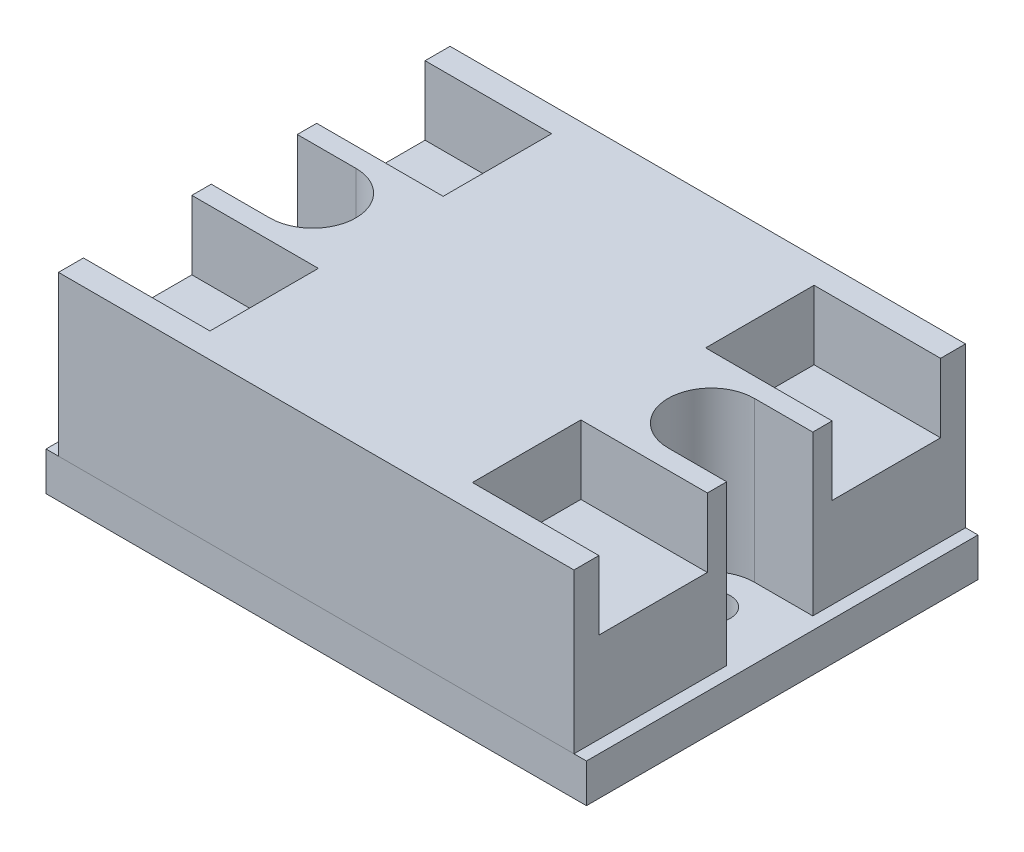
ISO-10303-21;
HEADER;
FILE_DESCRIPTION(('STEP AP214'),'2;1');
FILE_NAME('part.step','',(''),(''),'','','');
FILE_SCHEMA(('AUTOMOTIVE_DESIGN { 1 0 10303 214 1 1 1 1 }'));
ENDSEC;
DATA;
#1=APPLICATION_CONTEXT('core data for automotive mechanical design processes');
#2=APPLICATION_PROTOCOL_DEFINITION('international standard','automotive_design',2000,#1);
#3=PRODUCT_CONTEXT('',#1,'mechanical');
#4=PRODUCT('Part','Part','',(#3));
#5=PRODUCT_RELATED_PRODUCT_CATEGORY('part','',(#4));
#6=PRODUCT_DEFINITION_FORMATION('','',#4);
#7=PRODUCT_DEFINITION_CONTEXT('part definition',#1,'design');
#8=PRODUCT_DEFINITION('design','',#6,#7);
#9=PRODUCT_DEFINITION_SHAPE('','',#8);
#10=(LENGTH_UNIT() NAMED_UNIT(*) SI_UNIT(.MILLI.,.METRE.));
#11=(NAMED_UNIT(*) PLANE_ANGLE_UNIT() SI_UNIT($,.RADIAN.));
#12=(NAMED_UNIT(*) SI_UNIT($,.STERADIAN.) SOLID_ANGLE_UNIT());
#13=UNCERTAINTY_MEASURE_WITH_UNIT(LENGTH_MEASURE(1.E-05),#10,'distance_accuracy_value','');
#14=(GEOMETRIC_REPRESENTATION_CONTEXT(3) GLOBAL_UNCERTAINTY_ASSIGNED_CONTEXT((#13)) GLOBAL_UNIT_ASSIGNED_CONTEXT((#10,
#11,#12)) REPRESENTATION_CONTEXT('',''));
#15=CARTESIAN_POINT('',(0.,0.,0.));
#16=DIRECTION('',(0.,0.,1.));
#17=DIRECTION('',(1.,0.,0.));
#18=AXIS2_PLACEMENT_3D('',#15,#16,#17);
#19=CARTESIAN_POINT('',(-29.95,23.,-22.75));
#20=DIRECTION('',(1.,0.,0.));
#21=DIRECTION('',(0.,0.,-1.));
#22=AXIS2_PLACEMENT_3D('',#19,#20,#21);
#23=PLANE('',#22);
#24=DIRECTION('',(0.,0.,1.));
#25=VECTOR('',#24,1.);
#26=CARTESIAN_POINT('',(-29.95,15.,-19.85));
#27=LINE('',#26,#25);
#28=CARTESIAN_POINT('',(-29.95,15.,-19.85));
#29=VERTEX_POINT('',#28);
#30=CARTESIAN_POINT('',(-29.95,15.,-7.25));
#31=VERTEX_POINT('',#30);
#32=EDGE_CURVE('E265',#29,#31,#27,.T.);
#33=ORIENTED_EDGE('',*,*,#32,.F.);
#34=DIRECTION('',(0.,1.,0.));
#35=VECTOR('',#34,1.);
#36=CARTESIAN_POINT('',(-29.95,15.,-19.85));
#37=LINE('',#36,#35);
#38=CARTESIAN_POINT('',(-29.95,23.,-19.85));
#39=VERTEX_POINT('',#38);
#40=EDGE_CURVE('E287',#29,#39,#37,.T.);
#41=ORIENTED_EDGE('',*,*,#40,.T.);
#42=DIRECTION('',(0.,0.,1.));
#43=VECTOR('',#42,1.);
#44=CARTESIAN_POINT('',(-29.95,23.,-22.75));
#45=LINE('',#44,#43);
#46=CARTESIAN_POINT('',(-29.95,23.,-22.75));
#47=VERTEX_POINT('',#46);
#48=EDGE_CURVE('E398',#47,#39,#45,.T.);
#49=ORIENTED_EDGE('',*,*,#48,.F.);
#50=DIRECTION('',(0.,-1.,0.));
#51=VECTOR('',#50,1.);
#52=CARTESIAN_POINT('',(-29.95,23.,-22.75));
#53=LINE('',#52,#51);
#54=CARTESIAN_POINT('',(-29.95,4.5,-22.75));
#55=VERTEX_POINT('',#54);
#56=EDGE_CURVE('E414',#47,#55,#53,.T.);
#57=ORIENTED_EDGE('',*,*,#56,.T.);
#58=DIRECTION('',(0.,0.,1.));
#59=VECTOR('',#58,1.);
#60=CARTESIAN_POINT('',(-29.95,4.5,-22.75));
#61=LINE('',#60,#59);
#62=CARTESIAN_POINT('',(-29.95,4.5,-5.));
#63=VERTEX_POINT('',#62);
#64=EDGE_CURVE('E415',#55,#63,#61,.T.);
#65=ORIENTED_EDGE('',*,*,#64,.T.);
#66=DIRECTION('',(0.,1.,0.));
#67=VECTOR('',#66,1.);
#68=CARTESIAN_POINT('',(-29.95,23.,-5.));
#69=LINE('',#68,#67);
#70=CARTESIAN_POINT('',(-29.95,23.,-5.));
#71=VERTEX_POINT('',#70);
#72=EDGE_CURVE('E388',#63,#71,#69,.T.);
#73=ORIENTED_EDGE('',*,*,#72,.T.);
#74=CARTESIAN_POINT('',(-29.95,23.,-7.25));
#75=VERTEX_POINT('',#74);
#76=EDGE_CURVE('E402',#75,#71,#45,.T.);
#77=ORIENTED_EDGE('',*,*,#76,.F.);
#78=DIRECTION('',(0.,1.,0.));
#79=VECTOR('',#78,1.);
#80=CARTESIAN_POINT('',(-29.95,15.,-7.25));
#81=LINE('',#80,#79);
#82=EDGE_CURVE('E278',#31,#75,#81,.T.);
#83=ORIENTED_EDGE('',*,*,#82,.F.);
#84=EDGE_LOOP('',(#33,#41,#49,#57,#65,#73,#77,#83));
#85=FACE_BOUND('',#84,.T.);
#86=ADVANCED_FACE('F43',(#85),#23,.F.);
#87=CARTESIAN_POINT('',(29.95,23.,-22.75));
#88=DIRECTION('',(-1.,0.,0.));
#89=DIRECTION('',(0.,0.,1.));
#90=AXIS2_PLACEMENT_3D('',#87,#88,#89);
#91=PLANE('',#90);
#92=DIRECTION('',(0.,0.,-1.));
#93=VECTOR('',#92,1.);
#94=CARTESIAN_POINT('',(29.95,15.,19.85));
#95=LINE('',#94,#93);
#96=CARTESIAN_POINT('',(29.95,15.,19.85));
#97=VERTEX_POINT('',#96);
#98=CARTESIAN_POINT('',(29.95,15.,7.25));
#99=VERTEX_POINT('',#98);
#100=EDGE_CURVE('E296',#97,#99,#95,.T.);
#101=ORIENTED_EDGE('',*,*,#100,.F.);
#102=DIRECTION('',(0.,1.,0.));
#103=VECTOR('',#102,1.);
#104=CARTESIAN_POINT('',(29.95,15.,19.85));
#105=LINE('',#104,#103);
#106=CARTESIAN_POINT('',(29.95,23.,19.85));
#107=VERTEX_POINT('',#106);
#108=EDGE_CURVE('E283',#97,#107,#105,.T.);
#109=ORIENTED_EDGE('',*,*,#108,.T.);
#110=DIRECTION('',(0.,0.,-1.));
#111=VECTOR('',#110,1.);
#112=CARTESIAN_POINT('',(29.95,23.,-22.75));
#113=LINE('',#112,#111);
#114=CARTESIAN_POINT('',(29.95,23.,22.75));
#115=VERTEX_POINT('',#114);
#116=EDGE_CURVE('E407',#115,#107,#113,.T.);
#117=ORIENTED_EDGE('',*,*,#116,.F.);
#118=DIRECTION('',(0.,-1.,0.));
#119=VECTOR('',#118,1.);
#120=CARTESIAN_POINT('',(29.95,23.,22.75));
#121=LINE('',#120,#119);
#122=CARTESIAN_POINT('',(29.95,4.5,22.75));
#123=VERTEX_POINT('',#122);
#124=EDGE_CURVE('E431',#115,#123,#121,.T.);
#125=ORIENTED_EDGE('',*,*,#124,.T.);
#126=DIRECTION('',(0.,0.,-1.));
#127=VECTOR('',#126,1.);
#128=CARTESIAN_POINT('',(29.95,4.5,-22.75));
#129=LINE('',#128,#127);
#130=CARTESIAN_POINT('',(29.95,4.5,5.));
#131=VERTEX_POINT('',#130);
#132=EDGE_CURVE('E421',#123,#131,#129,.T.);
#133=ORIENTED_EDGE('',*,*,#132,.T.);
#134=DIRECTION('',(0.,1.,0.));
#135=VECTOR('',#134,1.);
#136=CARTESIAN_POINT('',(29.95,23.,5.));
#137=LINE('',#136,#135);
#138=CARTESIAN_POINT('',(29.95,23.,5.));
#139=VERTEX_POINT('',#138);
#140=EDGE_CURVE('E394',#131,#139,#137,.T.);
#141=ORIENTED_EDGE('',*,*,#140,.T.);
#142=CARTESIAN_POINT('',(29.95,23.,7.25));
#143=VERTEX_POINT('',#142);
#144=EDGE_CURVE('E411',#143,#139,#113,.T.);
#145=ORIENTED_EDGE('',*,*,#144,.F.);
#146=DIRECTION('',(0.,1.,0.));
#147=VECTOR('',#146,1.);
#148=CARTESIAN_POINT('',(29.95,15.,7.25));
#149=LINE('',#148,#147);
#150=EDGE_CURVE('E66',#99,#143,#149,.T.);
#151=ORIENTED_EDGE('',*,*,#150,.F.);
#152=EDGE_LOOP('',(#101,#109,#117,#125,#133,#141,#145,#151));
#153=FACE_BOUND('',#152,.T.);
#154=ADVANCED_FACE('F480',(#153),#91,.F.);
#155=CARTESIAN_POINT('',(-29.95,23.,19.85));
#156=VERTEX_POINT('',#155);
#157=CARTESIAN_POINT('',(-29.95,23.,22.75));
#158=VERTEX_POINT('',#157);
#159=EDGE_CURVE('E403',#156,#158,#45,.T.);
#160=ORIENTED_EDGE('',*,*,#159,.F.);
#161=DIRECTION('',(0.,1.,0.));
#162=VECTOR('',#161,1.);
#163=CARTESIAN_POINT('',(-29.95,15.,19.85));
#164=LINE('',#163,#162);
#165=CARTESIAN_POINT('',(-29.95,15.,19.85));
#166=VERTEX_POINT('',#165);
#167=EDGE_CURVE('E258',#166,#156,#164,.T.);
#168=ORIENTED_EDGE('',*,*,#167,.F.);
#169=DIRECTION('',(0.,0.,1.));
#170=VECTOR('',#169,1.);
#171=CARTESIAN_POINT('',(-29.95,15.,19.85));
#172=LINE('',#171,#170);
#173=CARTESIAN_POINT('',(-29.95,15.,7.25));
#174=VERTEX_POINT('',#173);
#175=EDGE_CURVE('E236',#174,#166,#172,.T.);
#176=ORIENTED_EDGE('',*,*,#175,.F.);
#177=DIRECTION('',(0.,1.,0.));
#178=VECTOR('',#177,1.);
#179=CARTESIAN_POINT('',(-29.95,15.,7.25));
#180=LINE('',#179,#178);
#181=CARTESIAN_POINT('',(-29.95,23.,7.25));
#182=VERTEX_POINT('',#181);
#183=EDGE_CURVE('E261',#174,#182,#180,.T.);
#184=ORIENTED_EDGE('',*,*,#183,.T.);
#185=CARTESIAN_POINT('',(-29.95,23.,5.));
#186=VERTEX_POINT('',#185);
#187=EDGE_CURVE('E404',#186,#182,#45,.T.);
#188=ORIENTED_EDGE('',*,*,#187,.F.);
#189=DIRECTION('',(0.,-1.,0.));
#190=VECTOR('',#189,1.);
#191=CARTESIAN_POINT('',(-29.95,23.,5.));
#192=LINE('',#191,#190);
#193=CARTESIAN_POINT('',(-29.95,4.5,5.));
#194=VERTEX_POINT('',#193);
#195=EDGE_CURVE('E369',#186,#194,#192,.T.);
#196=ORIENTED_EDGE('',*,*,#195,.T.);
#197=CARTESIAN_POINT('',(-29.95,4.5,22.75));
#198=VERTEX_POINT('',#197);
#199=EDGE_CURVE('E397',#194,#198,#61,.T.);
#200=ORIENTED_EDGE('',*,*,#199,.T.);
#201=DIRECTION('',(0.,-1.,0.));
#202=VECTOR('',#201,1.);
#203=CARTESIAN_POINT('',(-29.95,23.,22.75));
#204=LINE('',#203,#202);
#205=EDGE_CURVE('E434',#158,#198,#204,.T.);
#206=ORIENTED_EDGE('',*,*,#205,.F.);
#207=EDGE_LOOP('',(#160,#168,#176,#184,#188,#196,#200,#206));
#208=FACE_BOUND('',#207,.T.);
#209=ADVANCED_FACE('F45',(#208),#23,.F.);
#210=CARTESIAN_POINT('',(-29.95,23.,22.75));
#211=DIRECTION('',(0.,0.,-1.));
#212=DIRECTION('',(-1.,0.,0.));
#213=AXIS2_PLACEMENT_3D('',#210,#211,#212);
#214=PLANE('',#213);
#215=DIRECTION('',(1.,0.,0.));
#216=VECTOR('',#215,1.);
#217=CARTESIAN_POINT('',(-29.95,4.5,22.75));
#218=LINE('',#217,#216);
#219=EDGE_CURVE('E418',#198,#123,#218,.T.);
#220=ORIENTED_EDGE('',*,*,#219,.T.);
#221=ORIENTED_EDGE('',*,*,#124,.F.);
#222=DIRECTION('',(1.,0.,0.));
#223=VECTOR('',#222,1.);
#224=CARTESIAN_POINT('',(-29.95,23.,22.75));
#225=LINE('',#224,#223);
#226=EDGE_CURVE('E401',#158,#115,#225,.T.);
#227=ORIENTED_EDGE('',*,*,#226,.F.);
#228=ORIENTED_EDGE('',*,*,#205,.T.);
#229=EDGE_LOOP('',(#220,#221,#227,#228));
#230=FACE_BOUND('',#229,.T.);
#231=ADVANCED_FACE('F486',(#230),#214,.F.);
#232=DIRECTION('',(0.,0.,-1.));
#233=VECTOR('',#232,1.);
#234=CARTESIAN_POINT('',(29.95,15.,-19.85));
#235=LINE('',#234,#233);
#236=CARTESIAN_POINT('',(29.95,15.,-7.25));
#237=VERTEX_POINT('',#236);
#238=CARTESIAN_POINT('',(29.95,15.,-19.85));
#239=VERTEX_POINT('',#238);
#240=EDGE_CURVE('E321',#237,#239,#235,.T.);
#241=ORIENTED_EDGE('',*,*,#240,.F.);
#242=DIRECTION('',(0.,1.,0.));
#243=VECTOR('',#242,1.);
#244=CARTESIAN_POINT('',(29.95,15.,-7.25));
#245=LINE('',#244,#243);
#246=CARTESIAN_POINT('',(29.95,23.,-7.25));
#247=VERTEX_POINT('',#246);
#248=EDGE_CURVE('E341',#237,#247,#245,.T.);
#249=ORIENTED_EDGE('',*,*,#248,.T.);
#250=CARTESIAN_POINT('',(29.95,23.,-5.));
#251=VERTEX_POINT('',#250);
#252=EDGE_CURVE('E412',#251,#247,#113,.T.);
#253=ORIENTED_EDGE('',*,*,#252,.F.);
#254=DIRECTION('',(0.,-1.,0.));
#255=VECTOR('',#254,1.);
#256=CARTESIAN_POINT('',(29.95,23.,-5.));
#257=LINE('',#256,#255);
#258=CARTESIAN_POINT('',(29.95,4.5,-5.));
#259=VERTEX_POINT('',#258);
#260=EDGE_CURVE('E391',#251,#259,#257,.T.);
#261=ORIENTED_EDGE('',*,*,#260,.T.);
#262=CARTESIAN_POINT('',(29.95,4.5,-22.75));
#263=VERTEX_POINT('',#262);
#264=EDGE_CURVE('E420',#259,#263,#129,.T.);
#265=ORIENTED_EDGE('',*,*,#264,.T.);
#266=DIRECTION('',(0.,-1.,0.));
#267=VECTOR('',#266,1.);
#268=CARTESIAN_POINT('',(29.95,23.,-22.75));
#269=LINE('',#268,#267);
#270=CARTESIAN_POINT('',(29.95,23.,-22.75));
#271=VERTEX_POINT('',#270);
#272=EDGE_CURVE('E428',#271,#263,#269,.T.);
#273=ORIENTED_EDGE('',*,*,#272,.F.);
#274=CARTESIAN_POINT('',(29.95,23.,-19.85));
#275=VERTEX_POINT('',#274);
#276=EDGE_CURVE('E406',#275,#271,#113,.T.);
#277=ORIENTED_EDGE('',*,*,#276,.F.);
#278=DIRECTION('',(0.,1.,0.));
#279=VECTOR('',#278,1.);
#280=CARTESIAN_POINT('',(29.95,15.,-19.85));
#281=LINE('',#280,#279);
#282=EDGE_CURVE('E334',#239,#275,#281,.T.);
#283=ORIENTED_EDGE('',*,*,#282,.F.);
#284=EDGE_LOOP('',(#241,#249,#253,#261,#265,#273,#277,#283));
#285=FACE_BOUND('',#284,.T.);
#286=ADVANCED_FACE('F459',(#285),#91,.F.);
#287=CARTESIAN_POINT('',(-29.95,23.,-22.75));
#288=DIRECTION('',(0.,0.,1.));
#289=DIRECTION('',(1.,0.,0.));
#290=AXIS2_PLACEMENT_3D('',#287,#288,#289);
#291=PLANE('',#290);
#292=DIRECTION('',(-1.,0.,0.));
#293=VECTOR('',#292,1.);
#294=CARTESIAN_POINT('',(-29.95,4.5,-22.75));
#295=LINE('',#294,#293);
#296=EDGE_CURVE('E424',#263,#55,#295,.T.);
#297=ORIENTED_EDGE('',*,*,#296,.T.);
#298=ORIENTED_EDGE('',*,*,#56,.F.);
#299=DIRECTION('',(-1.,0.,0.));
#300=VECTOR('',#299,1.);
#301=CARTESIAN_POINT('',(-29.95,23.,-22.75));
#302=LINE('',#301,#300);
#303=EDGE_CURVE('E410',#271,#47,#302,.T.);
#304=ORIENTED_EDGE('',*,*,#303,.F.);
#305=ORIENTED_EDGE('',*,*,#272,.T.);
#306=EDGE_LOOP('',(#297,#298,#304,#305));
#307=FACE_BOUND('',#306,.T.);
#308=ADVANCED_FACE('F453',(#307),#291,.F.);
#309=CARTESIAN_POINT('',(0.,23.,0.));
#310=DIRECTION('',(0.,1.,0.));
#311=DIRECTION('',(0.,0.,1.));
#312=AXIS2_PLACEMENT_3D('',#309,#310,#311);
#313=PLANE('',#312);
#314=DIRECTION('',(-1.,0.,0.));
#315=VECTOR('',#314,1.);
#316=CARTESIAN_POINT('',(-29.95,23.,-19.85));
#317=LINE('',#316,#315);
#318=CARTESIAN_POINT('',(-15.25,23.,-19.85));
#319=VERTEX_POINT('',#318);
#320=EDGE_CURVE('E269',#319,#39,#317,.T.);
#321=ORIENTED_EDGE('',*,*,#320,.F.);
#322=DIRECTION('',(0.,0.,-1.));
#323=VECTOR('',#322,1.);
#324=CARTESIAN_POINT('',(-15.25,23.,-19.85));
#325=LINE('',#324,#323);
#326=CARTESIAN_POINT('',(-15.25,23.,-7.24999999999999));
#327=VERTEX_POINT('',#326);
#328=EDGE_CURVE('E282',#327,#319,#325,.T.);
#329=ORIENTED_EDGE('',*,*,#328,.F.);
#330=DIRECTION('',(1.,0.,0.));
#331=VECTOR('',#330,1.);
#332=CARTESIAN_POINT('',(-29.95,23.,-7.25));
#333=LINE('',#332,#331);
#334=EDGE_CURVE('E279',#75,#327,#333,.T.);
#335=ORIENTED_EDGE('',*,*,#334,.F.);
#336=ORIENTED_EDGE('',*,*,#76,.T.);
#337=DIRECTION('',(-1.,0.,0.));
#338=VECTOR('',#337,1.);
#339=CARTESIAN_POINT('',(-36.75,23.,-5.));
#340=LINE('',#339,#338);
#341=CARTESIAN_POINT('',(-23.15,23.,-5.));
#342=VERTEX_POINT('',#341);
#343=EDGE_CURVE('E378',#342,#71,#340,.T.);
#344=ORIENTED_EDGE('',*,*,#343,.F.);
#345=CARTESIAN_POINT('',(-23.15,23.,0.));
#346=DIRECTION('',(0.,1.,0.));
#347=DIRECTION('',(0.,0.,-1.));
#348=AXIS2_PLACEMENT_3D('',#345,#346,#347);
#349=CIRCLE('',#348,5.);
#350=CARTESIAN_POINT('',(-23.15,23.,5.));
#351=VERTEX_POINT('',#350);
#352=EDGE_CURVE('E375',#351,#342,#349,.T.);
#353=ORIENTED_EDGE('',*,*,#352,.F.);
#354=DIRECTION('',(1.,0.,0.));
#355=VECTOR('',#354,1.);
#356=CARTESIAN_POINT('',(-36.75,23.,5.));
#357=LINE('',#356,#355);
#358=EDGE_CURVE('E344',#186,#351,#357,.T.);
#359=ORIENTED_EDGE('',*,*,#358,.F.);
#360=ORIENTED_EDGE('',*,*,#187,.T.);
#361=DIRECTION('',(-1.,0.,0.));
#362=VECTOR('',#361,1.);
#363=CARTESIAN_POINT('',(-29.95,23.,7.25));
#364=LINE('',#363,#362);
#365=CARTESIAN_POINT('',(-15.25,23.,7.24999999999999));
#366=VERTEX_POINT('',#365);
#367=EDGE_CURVE('E249',#366,#182,#364,.T.);
#368=ORIENTED_EDGE('',*,*,#367,.F.);
#369=DIRECTION('',(0.,0.,-1.));
#370=VECTOR('',#369,1.);
#371=CARTESIAN_POINT('',(-15.25,23.,19.85));
#372=LINE('',#371,#370);
#373=CARTESIAN_POINT('',(-15.25,23.,19.85));
#374=VERTEX_POINT('',#373);
#375=EDGE_CURVE('E251',#374,#366,#372,.T.);
#376=ORIENTED_EDGE('',*,*,#375,.F.);
#377=DIRECTION('',(1.,0.,0.));
#378=VECTOR('',#377,1.);
#379=CARTESIAN_POINT('',(-29.95,23.,19.85));
#380=LINE('',#379,#378);
#381=EDGE_CURVE('E58',#156,#374,#380,.T.);
#382=ORIENTED_EDGE('',*,*,#381,.F.);
#383=ORIENTED_EDGE('',*,*,#159,.T.);
#384=ORIENTED_EDGE('',*,*,#226,.T.);
#385=ORIENTED_EDGE('',*,*,#116,.T.);
#386=DIRECTION('',(1.,0.,0.));
#387=VECTOR('',#386,1.);
#388=CARTESIAN_POINT('',(29.95,23.,19.85));
#389=LINE('',#388,#387);
#390=CARTESIAN_POINT('',(15.25,23.,19.85));
#391=VERTEX_POINT('',#390);
#392=EDGE_CURVE('E300',#391,#107,#389,.T.);
#393=ORIENTED_EDGE('',*,*,#392,.F.);
#394=DIRECTION('',(0.,0.,1.));
#395=VECTOR('',#394,1.);
#396=CARTESIAN_POINT('',(15.25,23.,19.85));
#397=LINE('',#396,#395);
#398=CARTESIAN_POINT('',(15.25,23.,7.24999999999999));
#399=VERTEX_POINT('',#398);
#400=EDGE_CURVE('E310',#399,#391,#397,.T.);
#401=ORIENTED_EDGE('',*,*,#400,.F.);
#402=DIRECTION('',(-1.,0.,0.));
#403=VECTOR('',#402,1.);
#404=CARTESIAN_POINT('',(29.95,23.,7.25));
#405=LINE('',#404,#403);
#406=EDGE_CURVE('E260',#143,#399,#405,.T.);
#407=ORIENTED_EDGE('',*,*,#406,.F.);
#408=ORIENTED_EDGE('',*,*,#144,.T.);
#409=DIRECTION('',(1.,0.,0.));
#410=VECTOR('',#409,1.);
#411=CARTESIAN_POINT('',(36.75,23.,5.));
#412=LINE('',#411,#410);
#413=CARTESIAN_POINT('',(23.15,23.,5.));
#414=VERTEX_POINT('',#413);
#415=EDGE_CURVE('E361',#414,#139,#412,.T.);
#416=ORIENTED_EDGE('',*,*,#415,.F.);
#417=CARTESIAN_POINT('',(23.15,23.,0.));
#418=DIRECTION('',(0.,1.,0.));
#419=DIRECTION('',(0.,0.,1.));
#420=AXIS2_PLACEMENT_3D('',#417,#418,#419);
#421=CIRCLE('',#420,5.);
#422=CARTESIAN_POINT('',(23.15,23.,-5.));
#423=VERTEX_POINT('',#422);
#424=EDGE_CURVE('E357',#423,#414,#421,.T.);
#425=ORIENTED_EDGE('',*,*,#424,.F.);
#426=DIRECTION('',(-1.,0.,0.));
#427=VECTOR('',#426,1.);
#428=CARTESIAN_POINT('',(36.75,23.,-5.));
#429=LINE('',#428,#427);
#430=EDGE_CURVE('E355',#251,#423,#429,.T.);
#431=ORIENTED_EDGE('',*,*,#430,.F.);
#432=ORIENTED_EDGE('',*,*,#252,.T.);
#433=DIRECTION('',(1.,0.,0.));
#434=VECTOR('',#433,1.);
#435=CARTESIAN_POINT('',(29.95,23.,-7.25));
#436=LINE('',#435,#434);
#437=CARTESIAN_POINT('',(15.25,23.,-7.24999999999999));
#438=VERTEX_POINT('',#437);
#439=EDGE_CURVE('E325',#438,#247,#436,.T.);
#440=ORIENTED_EDGE('',*,*,#439,.F.);
#441=DIRECTION('',(0.,0.,1.));
#442=VECTOR('',#441,1.);
#443=CARTESIAN_POINT('',(15.25,23.,-19.85));
#444=LINE('',#443,#442);
#445=CARTESIAN_POINT('',(15.25,23.,-19.85));
#446=VERTEX_POINT('',#445);
#447=EDGE_CURVE('E337',#446,#438,#444,.T.);
#448=ORIENTED_EDGE('',*,*,#447,.F.);
#449=DIRECTION('',(-1.,0.,0.));
#450=VECTOR('',#449,1.);
#451=CARTESIAN_POINT('',(29.95,23.,-19.85));
#452=LINE('',#451,#450);
#453=EDGE_CURVE('E290',#275,#446,#452,.T.);
#454=ORIENTED_EDGE('',*,*,#453,.F.);
#455=ORIENTED_EDGE('',*,*,#276,.T.);
#456=ORIENTED_EDGE('',*,*,#303,.T.);
#457=ORIENTED_EDGE('',*,*,#48,.T.);
#458=EDGE_LOOP('',(#321,#329,#335,#336,#344,#353,#359,#360,#368,#376,#382,#383,#384,#385,#393,
#401,#407,#408,#416,#425,#431,#432,#440,#448,#454,#455,#456,#457));
#459=FACE_BOUND('',#458,.T.);
#460=ADVANCED_FACE('F469',(#459),#313,.T.);
#461=CARTESIAN_POINT('',(0.,4.5,0.));
#462=DIRECTION('',(0.,1.,0.));
#463=DIRECTION('',(0.,0.,1.));
#464=AXIS2_PLACEMENT_3D('',#461,#462,#463);
#465=PLANE('',#464);
#466=CARTESIAN_POINT('',(23.15,4.5,0.));
#467=DIRECTION('',(0.,1.,0.));
#468=DIRECTION('',(0.,0.,1.));
#469=AXIS2_PLACEMENT_3D('',#466,#467,#468);
#470=CIRCLE('',#469,5.);
#471=CARTESIAN_POINT('',(23.15,4.5,5.));
#472=VERTEX_POINT('',#471);
#473=CARTESIAN_POINT('',(23.15,4.5,-5.));
#474=VERTEX_POINT('',#473);
#475=EDGE_CURVE('E350',#472,#474,#470,.F.);
#476=ORIENTED_EDGE('',*,*,#475,.F.);
#477=DIRECTION('',(1.,0.,0.));
#478=VECTOR('',#477,1.);
#479=CARTESIAN_POINT('',(0.,4.5,5.));
#480=LINE('',#479,#478);
#481=EDGE_CURVE('E12',#472,#131,#480,.T.);
#482=ORIENTED_EDGE('',*,*,#481,.T.);
#483=ORIENTED_EDGE('',*,*,#132,.F.);
#484=ORIENTED_EDGE('',*,*,#219,.F.);
#485=ORIENTED_EDGE('',*,*,#199,.F.);
#486=DIRECTION('',(-1.,0.,0.));
#487=VECTOR('',#486,1.);
#488=CARTESIAN_POINT('',(-36.75,4.5,5.));
#489=LINE('',#488,#487);
#490=CARTESIAN_POINT('',(-23.15,4.5,5.));
#491=VERTEX_POINT('',#490);
#492=EDGE_CURVE('E358',#491,#194,#489,.T.);
#493=ORIENTED_EDGE('',*,*,#492,.F.);
#494=CARTESIAN_POINT('',(-23.15,4.5,0.));
#495=DIRECTION('',(0.,1.,0.));
#496=DIRECTION('',(0.,0.,1.));
#497=AXIS2_PLACEMENT_3D('',#494,#495,#496);
#498=CIRCLE('',#497,5.);
#499=CARTESIAN_POINT('',(-23.15,4.5,-5.));
#500=VERTEX_POINT('',#499);
#501=EDGE_CURVE('E370',#500,#491,#498,.F.);
#502=ORIENTED_EDGE('',*,*,#501,.F.);
#503=DIRECTION('',(-1.,0.,0.));
#504=VECTOR('',#503,1.);
#505=CARTESIAN_POINT('',(0.,4.5,-5.));
#506=LINE('',#505,#504);
#507=EDGE_CURVE('E51',#500,#63,#506,.T.);
#508=ORIENTED_EDGE('',*,*,#507,.T.);
#509=ORIENTED_EDGE('',*,*,#64,.F.);
#510=ORIENTED_EDGE('',*,*,#296,.F.);
#511=ORIENTED_EDGE('',*,*,#264,.F.);
#512=DIRECTION('',(1.,0.,0.));
#513=VECTOR('',#512,1.);
#514=CARTESIAN_POINT('',(36.75,4.5,-5.));
#515=LINE('',#514,#513);
#516=EDGE_CURVE('E353',#474,#259,#515,.T.);
#517=ORIENTED_EDGE('',*,*,#516,.F.);
#518=EDGE_LOOP('',(#476,#482,#483,#484,#485,#493,#502,#508,#509,#510,#511,#517));
#519=FACE_BOUND('',#518,.T.);
#520=ADVANCED_FACE('F441',(#519),#465,.F.);
#521=CARTESIAN_POINT('',(-36.75,-21.1312309497613,-5.));
#522=DIRECTION('',(0.,0.,-1.));
#523=DIRECTION('',(-1.,0.,0.));
#524=AXIS2_PLACEMENT_3D('',#521,#522,#523);
#525=PLANE('',#524);
#526=ORIENTED_EDGE('',*,*,#507,.F.);
#527=DIRECTION('',(0.,1.,0.));
#528=VECTOR('',#527,1.);
#529=CARTESIAN_POINT('',(-23.15,-21.1312309497613,-5.));
#530=LINE('',#529,#528);
#531=EDGE_CURVE('E373',#500,#342,#530,.T.);
#532=ORIENTED_EDGE('',*,*,#531,.T.);
#533=ORIENTED_EDGE('',*,*,#343,.T.);
#534=ORIENTED_EDGE('',*,*,#72,.F.);
#535=EDGE_LOOP('',(#526,#532,#533,#534));
#536=FACE_BOUND('',#535,.T.);
#537=ADVANCED_FACE('F501',(#536),#525,.F.);
#538=CARTESIAN_POINT('',(-36.75,-21.1312309497613,5.));
#539=DIRECTION('',(0.,0.,1.));
#540=DIRECTION('',(1.,0.,0.));
#541=AXIS2_PLACEMENT_3D('',#538,#539,#540);
#542=PLANE('',#541);
#543=ORIENTED_EDGE('',*,*,#358,.T.);
#544=DIRECTION('',(0.,1.,0.));
#545=VECTOR('',#544,1.);
#546=CARTESIAN_POINT('',(-23.15,-21.1312309497613,5.));
#547=LINE('',#546,#545);
#548=EDGE_CURVE('E381',#491,#351,#547,.T.);
#549=ORIENTED_EDGE('',*,*,#548,.F.);
#550=ORIENTED_EDGE('',*,*,#492,.T.);
#551=ORIENTED_EDGE('',*,*,#195,.F.);
#552=EDGE_LOOP('',(#543,#549,#550,#551));
#553=FACE_BOUND('',#552,.T.);
#554=ADVANCED_FACE('F495',(#553),#542,.F.);
#555=CARTESIAN_POINT('',(-23.15,-21.1312309497613,0.));
#556=DIRECTION('',(0.,1.,0.));
#557=DIRECTION('',(0.,0.,1.));
#558=AXIS2_PLACEMENT_3D('',#555,#556,#557);
#559=CYLINDRICAL_SURFACE('',#558,5.);
#560=ORIENTED_EDGE('',*,*,#501,.T.);
#561=ORIENTED_EDGE('',*,*,#548,.T.);
#562=ORIENTED_EDGE('',*,*,#352,.T.);
#563=ORIENTED_EDGE('',*,*,#531,.F.);
#564=EDGE_LOOP('',(#560,#561,#562,#563));
#565=FACE_BOUND('',#564,.T.);
#566=ADVANCED_FACE('F500',(#565),#559,.F.);
#567=CARTESIAN_POINT('',(36.75,-21.1312309497613,5.));
#568=DIRECTION('',(0.,0.,1.));
#569=DIRECTION('',(1.,0.,0.));
#570=AXIS2_PLACEMENT_3D('',#567,#568,#569);
#571=PLANE('',#570);
#572=ORIENTED_EDGE('',*,*,#481,.F.);
#573=DIRECTION('',(0.,1.,0.));
#574=VECTOR('',#573,1.);
#575=CARTESIAN_POINT('',(23.15,-21.1312309497613,5.));
#576=LINE('',#575,#574);
#577=EDGE_CURVE('E354',#472,#414,#576,.T.);
#578=ORIENTED_EDGE('',*,*,#577,.T.);
#579=ORIENTED_EDGE('',*,*,#415,.T.);
#580=ORIENTED_EDGE('',*,*,#140,.F.);
#581=EDGE_LOOP('',(#572,#578,#579,#580));
#582=FACE_BOUND('',#581,.T.);
#583=ADVANCED_FACE('F529',(#582),#571,.F.);
#584=CARTESIAN_POINT('',(36.75,-21.1312309497613,-5.));
#585=DIRECTION('',(0.,0.,-1.));
#586=DIRECTION('',(-1.,0.,0.));
#587=AXIS2_PLACEMENT_3D('',#584,#585,#586);
#588=PLANE('',#587);
#589=ORIENTED_EDGE('',*,*,#430,.T.);
#590=DIRECTION('',(0.,1.,0.));
#591=VECTOR('',#590,1.);
#592=CARTESIAN_POINT('',(23.15,-21.1312309497613,-5.));
#593=LINE('',#592,#591);
#594=EDGE_CURVE('E364',#474,#423,#593,.T.);
#595=ORIENTED_EDGE('',*,*,#594,.F.);
#596=ORIENTED_EDGE('',*,*,#516,.T.);
#597=ORIENTED_EDGE('',*,*,#260,.F.);
#598=EDGE_LOOP('',(#589,#595,#596,#597));
#599=FACE_BOUND('',#598,.T.);
#600=ADVANCED_FACE('F465',(#599),#588,.F.);
#601=CARTESIAN_POINT('',(23.15,-21.1312309497613,0.));
#602=DIRECTION('',(0.,1.,0.));
#603=DIRECTION('',(0.,0.,1.));
#604=AXIS2_PLACEMENT_3D('',#601,#602,#603);
#605=CYLINDRICAL_SURFACE('',#604,5.);
#606=ORIENTED_EDGE('',*,*,#475,.T.);
#607=ORIENTED_EDGE('',*,*,#594,.T.);
#608=ORIENTED_EDGE('',*,*,#424,.T.);
#609=ORIENTED_EDGE('',*,*,#577,.F.);
#610=EDGE_LOOP('',(#606,#607,#608,#609));
#611=FACE_BOUND('',#610,.T.);
#612=ADVANCED_FACE('F474',(#611),#605,.F.);
#613=CARTESIAN_POINT('',(29.95,15.,-7.25));
#614=DIRECTION('',(0.,0.,1.));
#615=DIRECTION('',(1.,0.,0.));
#616=AXIS2_PLACEMENT_3D('',#613,#614,#615);
#617=PLANE('',#616);
#618=ORIENTED_EDGE('',*,*,#439,.T.);
#619=ORIENTED_EDGE('',*,*,#248,.F.);
#620=DIRECTION('',(1.,0.,0.));
#621=VECTOR('',#620,1.);
#622=CARTESIAN_POINT('',(29.95,15.,-7.25));
#623=LINE('',#622,#621);
#624=CARTESIAN_POINT('',(15.25,15.,-7.24999999999999));
#625=VERTEX_POINT('',#624);
#626=EDGE_CURVE('E331',#625,#237,#623,.T.);
#627=ORIENTED_EDGE('',*,*,#626,.F.);
#628=DIRECTION('',(0.,1.,0.));
#629=VECTOR('',#628,1.);
#630=CARTESIAN_POINT('',(15.25,15.,-7.24999999999999));
#631=LINE('',#630,#629);
#632=EDGE_CURVE('E345',#625,#438,#631,.T.);
#633=ORIENTED_EDGE('',*,*,#632,.T.);
#634=EDGE_LOOP('',(#618,#619,#627,#633));
#635=FACE_BOUND('',#634,.T.);
#636=ADVANCED_FACE('F542',(#635),#617,.F.);
#637=CARTESIAN_POINT('',(15.25,15.,-19.85));
#638=DIRECTION('',(-1.,0.,0.));
#639=DIRECTION('',(0.,0.,1.));
#640=AXIS2_PLACEMENT_3D('',#637,#638,#639);
#641=PLANE('',#640);
#642=ORIENTED_EDGE('',*,*,#447,.T.);
#643=ORIENTED_EDGE('',*,*,#632,.F.);
#644=DIRECTION('',(0.,0.,1.));
#645=VECTOR('',#644,1.);
#646=CARTESIAN_POINT('',(15.25,15.,-19.85));
#647=LINE('',#646,#645);
#648=CARTESIAN_POINT('',(15.25,15.,-19.85));
#649=VERTEX_POINT('',#648);
#650=EDGE_CURVE('E328',#649,#625,#647,.T.);
#651=ORIENTED_EDGE('',*,*,#650,.F.);
#652=DIRECTION('',(0.,1.,0.));
#653=VECTOR('',#652,1.);
#654=CARTESIAN_POINT('',(15.25,15.,-19.85));
#655=LINE('',#654,#653);
#656=EDGE_CURVE('E347',#649,#446,#655,.T.);
#657=ORIENTED_EDGE('',*,*,#656,.T.);
#658=EDGE_LOOP('',(#642,#643,#651,#657));
#659=FACE_BOUND('',#658,.T.);
#660=ADVANCED_FACE('F546',(#659),#641,.F.);
#661=CARTESIAN_POINT('',(29.95,15.,-19.85));
#662=DIRECTION('',(0.,0.,-1.));
#663=DIRECTION('',(-1.,0.,0.));
#664=AXIS2_PLACEMENT_3D('',#661,#662,#663);
#665=PLANE('',#664);
#666=ORIENTED_EDGE('',*,*,#453,.T.);
#667=ORIENTED_EDGE('',*,*,#656,.F.);
#668=DIRECTION('',(-1.,0.,0.));
#669=VECTOR('',#668,1.);
#670=CARTESIAN_POINT('',(29.95,15.,-19.85));
#671=LINE('',#670,#669);
#672=EDGE_CURVE('E324',#239,#649,#671,.T.);
#673=ORIENTED_EDGE('',*,*,#672,.F.);
#674=ORIENTED_EDGE('',*,*,#282,.T.);
#675=EDGE_LOOP('',(#666,#667,#673,#674));
#676=FACE_BOUND('',#675,.T.);
#677=ADVANCED_FACE('F539',(#676),#665,.F.);
#678=CARTESIAN_POINT('',(0.,15.,0.));
#679=DIRECTION('',(0.,-1.,0.));
#680=DIRECTION('',(0.,0.,-1.));
#681=AXIS2_PLACEMENT_3D('',#678,#679,#680);
#682=PLANE('',#681);
#683=ORIENTED_EDGE('',*,*,#240,.T.);
#684=ORIENTED_EDGE('',*,*,#672,.T.);
#685=ORIENTED_EDGE('',*,*,#650,.T.);
#686=ORIENTED_EDGE('',*,*,#626,.T.);
#687=EDGE_LOOP('',(#683,#684,#685,#686));
#688=FACE_BOUND('',#687,.T.);
#689=ADVANCED_FACE('F554',(#688),#682,.F.);
#690=CARTESIAN_POINT('',(-29.95,15.,19.85));
#691=DIRECTION('',(0.,0.,1.));
#692=DIRECTION('',(1.,0.,0.));
#693=AXIS2_PLACEMENT_3D('',#690,#691,#692);
#694=PLANE('',#693);
#695=ORIENTED_EDGE('',*,*,#381,.T.);
#696=DIRECTION('',(0.,1.,0.));
#697=VECTOR('',#696,1.);
#698=CARTESIAN_POINT('',(-15.25,15.,19.85));
#699=LINE('',#698,#697);
#700=CARTESIAN_POINT('',(-15.25,15.,19.85));
#701=VERTEX_POINT('',#700);
#702=EDGE_CURVE('E226',#701,#374,#699,.T.);
#703=ORIENTED_EDGE('',*,*,#702,.F.);
#704=DIRECTION('',(1.,0.,0.));
#705=VECTOR('',#704,1.);
#706=CARTESIAN_POINT('',(-29.95,15.,19.85));
#707=LINE('',#706,#705);
#708=EDGE_CURVE('E230',#166,#701,#707,.T.);
#709=ORIENTED_EDGE('',*,*,#708,.F.);
#710=ORIENTED_EDGE('',*,*,#167,.T.);
#711=EDGE_LOOP('',(#695,#703,#709,#710));
#712=FACE_BOUND('',#711,.T.);
#713=ADVANCED_FACE('F228',(#712),#694,.F.);
#714=CARTESIAN_POINT('',(-29.95,15.,7.25));
#715=DIRECTION('',(0.,0.,-1.));
#716=DIRECTION('',(-1.,0.,0.));
#717=AXIS2_PLACEMENT_3D('',#714,#715,#716);
#718=PLANE('',#717);
#719=ORIENTED_EDGE('',*,*,#367,.T.);
#720=ORIENTED_EDGE('',*,*,#183,.F.);
#721=DIRECTION('',(-1.,0.,0.));
#722=VECTOR('',#721,1.);
#723=CARTESIAN_POINT('',(-29.95,15.,7.25));
#724=LINE('',#723,#722);
#725=CARTESIAN_POINT('',(-15.25,15.,7.24999999999999));
#726=VERTEX_POINT('',#725);
#727=EDGE_CURVE('E244',#726,#174,#724,.T.);
#728=ORIENTED_EDGE('',*,*,#727,.F.);
#729=DIRECTION('',(0.,1.,0.));
#730=VECTOR('',#729,1.);
#731=CARTESIAN_POINT('',(-15.25,15.,7.24999999999999));
#732=LINE('',#731,#730);
#733=EDGE_CURVE('E235',#726,#366,#732,.T.);
#734=ORIENTED_EDGE('',*,*,#733,.T.);
#735=EDGE_LOOP('',(#719,#720,#728,#734));
#736=FACE_BOUND('',#735,.T.);
#737=ADVANCED_FACE('F591',(#736),#718,.F.);
#738=CARTESIAN_POINT('',(-15.25,15.,19.85));
#739=DIRECTION('',(1.,0.,0.));
#740=DIRECTION('',(0.,0.,-1.));
#741=AXIS2_PLACEMENT_3D('',#738,#739,#740);
#742=PLANE('',#741);
#743=ORIENTED_EDGE('',*,*,#375,.T.);
#744=ORIENTED_EDGE('',*,*,#733,.F.);
#745=DIRECTION('',(0.,0.,-1.));
#746=VECTOR('',#745,1.);
#747=CARTESIAN_POINT('',(-15.25,15.,19.85));
#748=LINE('',#747,#746);
#749=EDGE_CURVE('E239',#701,#726,#748,.T.);
#750=ORIENTED_EDGE('',*,*,#749,.F.);
#751=ORIENTED_EDGE('',*,*,#702,.T.);
#752=EDGE_LOOP('',(#743,#744,#750,#751));
#753=FACE_BOUND('',#752,.T.);
#754=ADVANCED_FACE('F240',(#753),#742,.F.);
#755=CARTESIAN_POINT('',(0.,15.,0.));
#756=DIRECTION('',(0.,1.,0.));
#757=DIRECTION('',(0.,0.,1.));
#758=AXIS2_PLACEMENT_3D('',#755,#756,#757);
#759=PLANE('',#758);
#760=ORIENTED_EDGE('',*,*,#708,.T.);
#761=ORIENTED_EDGE('',*,*,#749,.T.);
#762=ORIENTED_EDGE('',*,*,#727,.T.);
#763=ORIENTED_EDGE('',*,*,#175,.T.);
#764=EDGE_LOOP('',(#760,#761,#762,#763));
#765=FACE_BOUND('',#764,.T.);
#766=ADVANCED_FACE('F246',(#765),#759,.T.);
#767=CARTESIAN_POINT('',(29.95,15.,19.85));
#768=DIRECTION('',(0.,0.,1.));
#769=DIRECTION('',(1.,0.,0.));
#770=AXIS2_PLACEMENT_3D('',#767,#768,#769);
#771=PLANE('',#770);
#772=ORIENTED_EDGE('',*,*,#392,.T.);
#773=ORIENTED_EDGE('',*,*,#108,.F.);
#774=DIRECTION('',(1.,0.,0.));
#775=VECTOR('',#774,1.);
#776=CARTESIAN_POINT('',(29.95,15.,19.85));
#777=LINE('',#776,#775);
#778=CARTESIAN_POINT('',(15.25,15.,19.85));
#779=VERTEX_POINT('',#778);
#780=EDGE_CURVE('E306',#779,#97,#777,.T.);
#781=ORIENTED_EDGE('',*,*,#780,.F.);
#782=DIRECTION('',(0.,1.,0.));
#783=VECTOR('',#782,1.);
#784=CARTESIAN_POINT('',(15.25,15.,19.85));
#785=LINE('',#784,#783);
#786=EDGE_CURVE('E316',#779,#391,#785,.T.);
#787=ORIENTED_EDGE('',*,*,#786,.T.);
#788=EDGE_LOOP('',(#772,#773,#781,#787));
#789=FACE_BOUND('',#788,.T.);
#790=ADVANCED_FACE('F565',(#789),#771,.F.);
#791=CARTESIAN_POINT('',(15.25,15.,19.85));
#792=DIRECTION('',(-1.,0.,0.));
#793=DIRECTION('',(0.,0.,1.));
#794=AXIS2_PLACEMENT_3D('',#791,#792,#793);
#795=PLANE('',#794);
#796=ORIENTED_EDGE('',*,*,#400,.T.);
#797=ORIENTED_EDGE('',*,*,#786,.F.);
#798=DIRECTION('',(0.,0.,1.));
#799=VECTOR('',#798,1.);
#800=CARTESIAN_POINT('',(15.25,15.,19.85));
#801=LINE('',#800,#799);
#802=CARTESIAN_POINT('',(15.25,15.,7.24999999999999));
#803=VERTEX_POINT('',#802);
#804=EDGE_CURVE('E303',#803,#779,#801,.T.);
#805=ORIENTED_EDGE('',*,*,#804,.F.);
#806=DIRECTION('',(0.,1.,0.));
#807=VECTOR('',#806,1.);
#808=CARTESIAN_POINT('',(15.25,15.,7.24999999999999));
#809=LINE('',#808,#807);
#810=EDGE_CURVE('E318',#803,#399,#809,.T.);
#811=ORIENTED_EDGE('',*,*,#810,.T.);
#812=EDGE_LOOP('',(#796,#797,#805,#811));
#813=FACE_BOUND('',#812,.T.);
#814=ADVANCED_FACE('F562',(#813),#795,.F.);
#815=CARTESIAN_POINT('',(29.95,15.,7.25));
#816=DIRECTION('',(0.,0.,-1.));
#817=DIRECTION('',(-1.,0.,0.));
#818=AXIS2_PLACEMENT_3D('',#815,#816,#817);
#819=PLANE('',#818);
#820=ORIENTED_EDGE('',*,*,#406,.T.);
#821=ORIENTED_EDGE('',*,*,#810,.F.);
#822=DIRECTION('',(-1.,0.,0.));
#823=VECTOR('',#822,1.);
#824=CARTESIAN_POINT('',(29.95,15.,7.25));
#825=LINE('',#824,#823);
#826=EDGE_CURVE('E299',#99,#803,#825,.T.);
#827=ORIENTED_EDGE('',*,*,#826,.F.);
#828=ORIENTED_EDGE('',*,*,#150,.T.);
#829=EDGE_LOOP('',(#820,#821,#827,#828));
#830=FACE_BOUND('',#829,.T.);
#831=ADVANCED_FACE('F558',(#830),#819,.F.);
#832=CARTESIAN_POINT('',(0.,15.,0.));
#833=DIRECTION('',(0.,1.,0.));
#834=DIRECTION('',(0.,0.,1.));
#835=AXIS2_PLACEMENT_3D('',#832,#833,#834);
#836=PLANE('',#835);
#837=ORIENTED_EDGE('',*,*,#100,.T.);
#838=ORIENTED_EDGE('',*,*,#826,.T.);
#839=ORIENTED_EDGE('',*,*,#804,.T.);
#840=ORIENTED_EDGE('',*,*,#780,.T.);
#841=EDGE_LOOP('',(#837,#838,#839,#840));
#842=FACE_BOUND('',#841,.T.);
#843=ADVANCED_FACE('F561',(#842),#836,.T.);
#844=CARTESIAN_POINT('',(-29.95,15.,-19.85));
#845=DIRECTION('',(0.,0.,-1.));
#846=DIRECTION('',(-1.,0.,0.));
#847=AXIS2_PLACEMENT_3D('',#844,#845,#846);
#848=PLANE('',#847);
#849=ORIENTED_EDGE('',*,*,#320,.T.);
#850=ORIENTED_EDGE('',*,*,#40,.F.);
#851=DIRECTION('',(-1.,0.,0.));
#852=VECTOR('',#851,1.);
#853=CARTESIAN_POINT('',(-29.95,15.,-19.85));
#854=LINE('',#853,#852);
#855=CARTESIAN_POINT('',(-15.25,15.,-19.85));
#856=VERTEX_POINT('',#855);
#857=EDGE_CURVE('E275',#856,#29,#854,.T.);
#858=ORIENTED_EDGE('',*,*,#857,.F.);
#859=DIRECTION('',(0.,1.,0.));
#860=VECTOR('',#859,1.);
#861=CARTESIAN_POINT('',(-15.25,15.,-19.85));
#862=LINE('',#861,#860);
#863=EDGE_CURVE('E291',#856,#319,#862,.T.);
#864=ORIENTED_EDGE('',*,*,#863,.T.);
#865=EDGE_LOOP('',(#849,#850,#858,#864));
#866=FACE_BOUND('',#865,.T.);
#867=ADVANCED_FACE('F572',(#866),#848,.F.);
#868=CARTESIAN_POINT('',(-15.25,15.,-19.85));
#869=DIRECTION('',(1.,0.,0.));
#870=DIRECTION('',(0.,0.,-1.));
#871=AXIS2_PLACEMENT_3D('',#868,#869,#870);
#872=PLANE('',#871);
#873=ORIENTED_EDGE('',*,*,#328,.T.);
#874=ORIENTED_EDGE('',*,*,#863,.F.);
#875=DIRECTION('',(0.,0.,-1.));
#876=VECTOR('',#875,1.);
#877=CARTESIAN_POINT('',(-15.25,15.,-19.85));
#878=LINE('',#877,#876);
#879=CARTESIAN_POINT('',(-15.25,15.,-7.24999999999999));
#880=VERTEX_POINT('',#879);
#881=EDGE_CURVE('E272',#880,#856,#878,.T.);
#882=ORIENTED_EDGE('',*,*,#881,.F.);
#883=DIRECTION('',(0.,1.,0.));
#884=VECTOR('',#883,1.);
#885=CARTESIAN_POINT('',(-15.25,15.,-7.24999999999999));
#886=LINE('',#885,#884);
#887=EDGE_CURVE('E293',#880,#327,#886,.T.);
#888=ORIENTED_EDGE('',*,*,#887,.T.);
#889=EDGE_LOOP('',(#873,#874,#882,#888));
#890=FACE_BOUND('',#889,.T.);
#891=ADVANCED_FACE('F578',(#890),#872,.F.);
#892=CARTESIAN_POINT('',(-29.95,15.,-7.25));
#893=DIRECTION('',(0.,0.,1.));
#894=DIRECTION('',(1.,0.,0.));
#895=AXIS2_PLACEMENT_3D('',#892,#893,#894);
#896=PLANE('',#895);
#897=ORIENTED_EDGE('',*,*,#334,.T.);
#898=ORIENTED_EDGE('',*,*,#887,.F.);
#899=DIRECTION('',(1.,0.,0.));
#900=VECTOR('',#899,1.);
#901=CARTESIAN_POINT('',(-29.95,15.,-7.25));
#902=LINE('',#901,#900);
#903=EDGE_CURVE('E268',#31,#880,#902,.T.);
#904=ORIENTED_EDGE('',*,*,#903,.F.);
#905=ORIENTED_EDGE('',*,*,#82,.T.);
#906=EDGE_LOOP('',(#897,#898,#904,#905));
#907=FACE_BOUND('',#906,.T.);
#908=ADVANCED_FACE('F574',(#907),#896,.F.);
#909=CARTESIAN_POINT('',(0.,15.,0.));
#910=DIRECTION('',(0.,1.,0.));
#911=DIRECTION('',(0.,0.,1.));
#912=AXIS2_PLACEMENT_3D('',#909,#910,#911);
#913=PLANE('',#912);
#914=ORIENTED_EDGE('',*,*,#32,.T.);
#915=ORIENTED_EDGE('',*,*,#903,.T.);
#916=ORIENTED_EDGE('',*,*,#881,.T.);
#917=ORIENTED_EDGE('',*,*,#857,.T.);
#918=EDGE_LOOP('',(#914,#915,#916,#917));
#919=FACE_BOUND('',#918,.T.);
#920=ADVANCED_FACE('F577',(#919),#913,.T.);
#921=CLOSED_SHELL('',(#86,#154,#209,#231,#286,#308,#460,#520,#537,#554,#566,#583,#600,#612,#636,
#660,#677,#689,#713,#737,#754,#766,#790,#814,#831,#843,#867,#891,#908,#920));
#922=MANIFOLD_SOLID_BREP('B2',#921);
#923=CARTESIAN_POINT('',(-31.4,4.5,-22.75));
#924=DIRECTION('',(1.,0.,0.));
#925=DIRECTION('',(0.,0.,-1.));
#926=AXIS2_PLACEMENT_3D('',#923,#924,#925);
#927=PLANE('',#926);
#928=DIRECTION('',(0.,0.,1.));
#929=VECTOR('',#928,1.);
#930=CARTESIAN_POINT('',(-31.4,0.,-22.75));
#931=LINE('',#930,#929);
#932=CARTESIAN_POINT('',(-31.4,0.,-22.75));
#933=VERTEX_POINT('',#932);
#934=CARTESIAN_POINT('',(-31.4,0.,22.75));
#935=VERTEX_POINT('',#934);
#936=EDGE_CURVE('E844',#933,#935,#931,.T.);
#937=ORIENTED_EDGE('',*,*,#936,.T.);
#938=DIRECTION('',(0.,-1.,0.));
#939=VECTOR('',#938,1.);
#940=CARTESIAN_POINT('',(-31.4,4.5,22.75));
#941=LINE('',#940,#939);
#942=CARTESIAN_POINT('',(-31.4,4.5,22.75));
#943=VERTEX_POINT('',#942);
#944=EDGE_CURVE('E41',#943,#935,#941,.T.);
#945=ORIENTED_EDGE('',*,*,#944,.F.);
#946=DIRECTION('',(0.,0.,1.));
#947=VECTOR('',#946,1.);
#948=CARTESIAN_POINT('',(-31.4,4.5,-22.75));
#949=LINE('',#948,#947);
#950=CARTESIAN_POINT('',(-31.4,4.5,-22.75));
#951=VERTEX_POINT('',#950);
#952=EDGE_CURVE('E825',#951,#943,#949,.T.);
#953=ORIENTED_EDGE('',*,*,#952,.F.);
#954=DIRECTION('',(0.,-1.,0.));
#955=VECTOR('',#954,1.);
#956=CARTESIAN_POINT('',(-31.4,4.5,-22.75));
#957=LINE('',#956,#955);
#958=EDGE_CURVE('E840',#951,#933,#957,.T.);
#959=ORIENTED_EDGE('',*,*,#958,.T.);
#960=EDGE_LOOP('',(#937,#945,#953,#959));
#961=FACE_BOUND('',#960,.T.);
#962=ADVANCED_FACE('F781',(#961),#927,.F.);
#963=CARTESIAN_POINT('',(-31.4,4.5,22.75));
#964=DIRECTION('',(0.,0.,-1.));
#965=DIRECTION('',(-1.,0.,0.));
#966=AXIS2_PLACEMENT_3D('',#963,#964,#965);
#967=PLANE('',#966);
#968=DIRECTION('',(1.,0.,0.));
#969=VECTOR('',#968,1.);
#970=CARTESIAN_POINT('',(-31.4,0.,22.75));
#971=LINE('',#970,#969);
#972=CARTESIAN_POINT('',(31.4,0.,22.75));
#973=VERTEX_POINT('',#972);
#974=EDGE_CURVE('E836',#935,#973,#971,.T.);
#975=ORIENTED_EDGE('',*,*,#974,.T.);
#976=DIRECTION('',(0.,-1.,0.));
#977=VECTOR('',#976,1.);
#978=CARTESIAN_POINT('',(31.4,4.5,22.75));
#979=LINE('',#978,#977);
#980=CARTESIAN_POINT('',(31.4,4.5,22.75));
#981=VERTEX_POINT('',#980);
#982=EDGE_CURVE('E789',#981,#973,#979,.T.);
#983=ORIENTED_EDGE('',*,*,#982,.F.);
#984=DIRECTION('',(1.,0.,0.));
#985=VECTOR('',#984,1.);
#986=CARTESIAN_POINT('',(-31.4,4.5,22.75));
#987=LINE('',#986,#985);
#988=EDGE_CURVE('E827',#943,#981,#987,.T.);
#989=ORIENTED_EDGE('',*,*,#988,.F.);
#990=ORIENTED_EDGE('',*,*,#944,.T.);
#991=EDGE_LOOP('',(#975,#983,#989,#990));
#992=FACE_BOUND('',#991,.T.);
#993=ADVANCED_FACE('F835',(#992),#967,.F.);
#994=CARTESIAN_POINT('',(31.4,4.5,-22.75));
#995=DIRECTION('',(-1.,0.,0.));
#996=DIRECTION('',(0.,0.,1.));
#997=AXIS2_PLACEMENT_3D('',#994,#995,#996);
#998=PLANE('',#997);
#999=DIRECTION('',(0.,0.,-1.));
#1000=VECTOR('',#999,1.);
#1001=CARTESIAN_POINT('',(31.4,0.,-22.75));
#1002=LINE('',#1001,#1000);
#1003=CARTESIAN_POINT('',(31.4,0.,-22.75));
#1004=VERTEX_POINT('',#1003);
#1005=EDGE_CURVE('E814',#973,#1004,#1002,.T.);
#1006=ORIENTED_EDGE('',*,*,#1005,.T.);
#1007=DIRECTION('',(0.,-1.,0.));
#1008=VECTOR('',#1007,1.);
#1009=CARTESIAN_POINT('',(31.4,4.5,-22.75));
#1010=LINE('',#1009,#1008);
#1011=CARTESIAN_POINT('',(31.4,4.5,-22.75));
#1012=VERTEX_POINT('',#1011);
#1013=EDGE_CURVE('E837',#1012,#1004,#1010,.T.);
#1014=ORIENTED_EDGE('',*,*,#1013,.F.);
#1015=DIRECTION('',(0.,0.,-1.));
#1016=VECTOR('',#1015,1.);
#1017=CARTESIAN_POINT('',(31.4,4.5,-22.75));
#1018=LINE('',#1017,#1016);
#1019=EDGE_CURVE('E831',#981,#1012,#1018,.T.);
#1020=ORIENTED_EDGE('',*,*,#1019,.F.);
#1021=ORIENTED_EDGE('',*,*,#982,.T.);
#1022=EDGE_LOOP('',(#1006,#1014,#1020,#1021));
#1023=FACE_BOUND('',#1022,.T.);
#1024=ADVANCED_FACE('F838',(#1023),#998,.F.);
#1025=CARTESIAN_POINT('',(-31.4,4.5,-22.75));
#1026=DIRECTION('',(0.,0.,1.));
#1027=DIRECTION('',(1.,0.,0.));
#1028=AXIS2_PLACEMENT_3D('',#1025,#1026,#1027);
#1029=PLANE('',#1028);
#1030=DIRECTION('',(-1.,0.,0.));
#1031=VECTOR('',#1030,1.);
#1032=CARTESIAN_POINT('',(-31.4,0.,-22.75));
#1033=LINE('',#1032,#1031);
#1034=EDGE_CURVE('E820',#1004,#933,#1033,.T.);
#1035=ORIENTED_EDGE('',*,*,#1034,.T.);
#1036=ORIENTED_EDGE('',*,*,#958,.F.);
#1037=DIRECTION('',(-1.,0.,0.));
#1038=VECTOR('',#1037,1.);
#1039=CARTESIAN_POINT('',(-31.4,4.5,-22.75));
#1040=LINE('',#1039,#1038);
#1041=EDGE_CURVE('E797',#1012,#951,#1040,.T.);
#1042=ORIENTED_EDGE('',*,*,#1041,.F.);
#1043=ORIENTED_EDGE('',*,*,#1013,.T.);
#1044=EDGE_LOOP('',(#1035,#1036,#1042,#1043));
#1045=FACE_BOUND('',#1044,.T.);
#1046=ADVANCED_FACE('F852',(#1045),#1029,.F.);
#1047=CARTESIAN_POINT('',(0.,4.5,0.));
#1048=DIRECTION('',(0.,1.,0.));
#1049=DIRECTION('',(0.,0.,1.));
#1050=AXIS2_PLACEMENT_3D('',#1047,#1048,#1049);
#1051=PLANE('',#1050);
#1052=CARTESIAN_POINT('',(23.15,4.5,0.));
#1053=DIRECTION('',(0.,1.,0.));
#1054=DIRECTION('',(0.,0.,1.));
#1055=AXIS2_PLACEMENT_3D('',#1052,#1053,#1054);
#1056=CIRCLE('',#1055,2.25);
#1057=CARTESIAN_POINT('',(23.15,4.5,2.25));
#1058=VERTEX_POINT('',#1057);
#1059=EDGE_CURVE('E866',#1058,#1058,#1056,.T.);
#1060=ORIENTED_EDGE('',*,*,#1059,.F.);
#1061=EDGE_LOOP('',(#1060));
#1062=FACE_BOUND('',#1061,.T.);
#1063=CARTESIAN_POINT('',(-23.15,4.5,0.));
#1064=DIRECTION('',(0.,1.,0.));
#1065=DIRECTION('',(0.,0.,1.));
#1066=AXIS2_PLACEMENT_3D('',#1063,#1064,#1065);
#1067=CIRCLE('',#1066,2.25);
#1068=CARTESIAN_POINT('',(-23.15,4.5,2.25));
#1069=VERTEX_POINT('',#1068);
#1070=EDGE_CURVE('E860',#1069,#1069,#1067,.T.);
#1071=ORIENTED_EDGE('',*,*,#1070,.F.);
#1072=EDGE_LOOP('',(#1071));
#1073=FACE_BOUND('',#1072,.T.);
#1074=ORIENTED_EDGE('',*,*,#952,.T.);
#1075=ORIENTED_EDGE('',*,*,#988,.T.);
#1076=ORIENTED_EDGE('',*,*,#1019,.T.);
#1077=ORIENTED_EDGE('',*,*,#1041,.T.);
#1078=EDGE_LOOP('',(#1074,#1075,#1076,#1077));
#1079=FACE_BOUND('',#1078,.T.);
#1080=ADVANCED_FACE('F829',(#1062,#1073,#1079),#1051,.T.);
#1081=CARTESIAN_POINT('',(0.,0.,0.));
#1082=DIRECTION('',(0.,1.,0.));
#1083=DIRECTION('',(0.,0.,1.));
#1084=AXIS2_PLACEMENT_3D('',#1081,#1082,#1083);
#1085=PLANE('',#1084);
#1086=CARTESIAN_POINT('',(23.15,0.,0.));
#1087=DIRECTION('',(0.,1.,0.));
#1088=DIRECTION('',(0.,0.,1.));
#1089=AXIS2_PLACEMENT_3D('',#1086,#1087,#1088);
#1090=CIRCLE('',#1089,2.25);
#1091=CARTESIAN_POINT('',(23.15,0.,2.25));
#1092=VERTEX_POINT('',#1091);
#1093=EDGE_CURVE('E863',#1092,#1092,#1090,.T.);
#1094=ORIENTED_EDGE('',*,*,#1093,.T.);
#1095=EDGE_LOOP('',(#1094));
#1096=FACE_BOUND('',#1095,.T.);
#1097=CARTESIAN_POINT('',(-23.15,0.,0.));
#1098=DIRECTION('',(0.,1.,0.));
#1099=DIRECTION('',(0.,0.,1.));
#1100=AXIS2_PLACEMENT_3D('',#1097,#1098,#1099);
#1101=CIRCLE('',#1100,2.25);
#1102=CARTESIAN_POINT('',(-23.15,0.,2.25));
#1103=VERTEX_POINT('',#1102);
#1104=EDGE_CURVE('E847',#1103,#1103,#1101,.T.);
#1105=ORIENTED_EDGE('',*,*,#1104,.T.);
#1106=EDGE_LOOP('',(#1105));
#1107=FACE_BOUND('',#1106,.T.);
#1108=ORIENTED_EDGE('',*,*,#936,.F.);
#1109=ORIENTED_EDGE('',*,*,#1034,.F.);
#1110=ORIENTED_EDGE('',*,*,#1005,.F.);
#1111=ORIENTED_EDGE('',*,*,#974,.F.);
#1112=EDGE_LOOP('',(#1108,#1109,#1110,#1111));
#1113=FACE_BOUND('',#1112,.T.);
#1114=ADVANCED_FACE('F855',(#1096,#1107,#1113),#1085,.F.);
#1115=CARTESIAN_POINT('',(-23.15,4.5,0.));
#1116=DIRECTION('',(0.,1.,0.));
#1117=DIRECTION('',(0.,0.,1.));
#1118=AXIS2_PLACEMENT_3D('',#1115,#1116,#1117);
#1119=CYLINDRICAL_SURFACE('',#1118,2.25);
#1120=ORIENTED_EDGE('',*,*,#1104,.F.);
#1121=EDGE_LOOP('',(#1120));
#1122=FACE_BOUND('',#1121,.T.);
#1123=ORIENTED_EDGE('',*,*,#1070,.T.);
#1124=EDGE_LOOP('',(#1123));
#1125=FACE_BOUND('',#1124,.T.);
#1126=ADVANCED_FACE('F877',(#1122,#1125),#1119,.F.);
#1127=CARTESIAN_POINT('',(23.15,4.5,0.));
#1128=DIRECTION('',(0.,1.,0.));
#1129=DIRECTION('',(0.,0.,1.));
#1130=AXIS2_PLACEMENT_3D('',#1127,#1128,#1129);
#1131=CYLINDRICAL_SURFACE('',#1130,2.25);
#1132=ORIENTED_EDGE('',*,*,#1093,.F.);
#1133=EDGE_LOOP('',(#1132));
#1134=FACE_BOUND('',#1133,.T.);
#1135=ORIENTED_EDGE('',*,*,#1059,.T.);
#1136=EDGE_LOOP('',(#1135));
#1137=FACE_BOUND('',#1136,.T.);
#1138=ADVANCED_FACE('F870',(#1134,#1137),#1131,.F.);
#1139=CLOSED_SHELL('',(#962,#993,#1024,#1046,#1080,#1114,#1126,#1138));
#1140=MANIFOLD_SOLID_BREP('B6',#1139);
#1141=ADVANCED_BREP_SHAPE_REPRESENTATION('',(#18,#922,#1140),#14);
#1142=SHAPE_DEFINITION_REPRESENTATION(#9,#1141);
ENDSEC;
END-ISO-10303-21;
